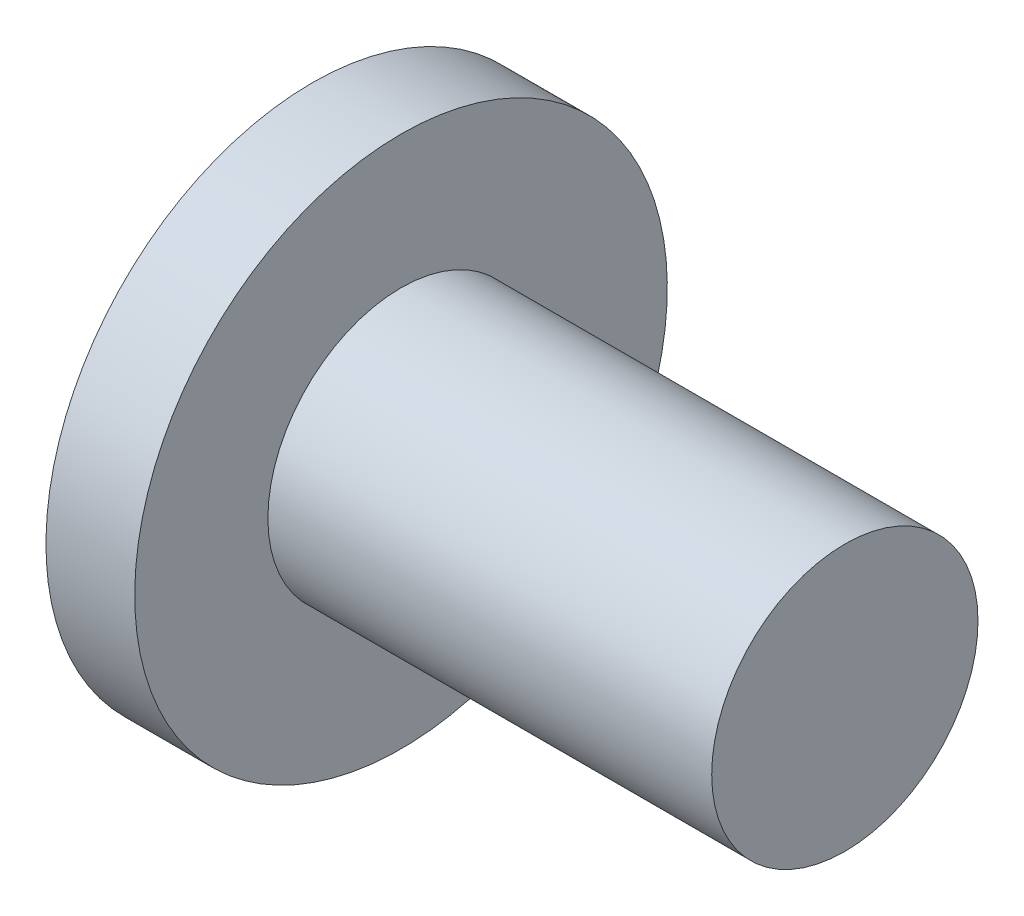
ISO-10303-21;
HEADER;
FILE_DESCRIPTION(('STEP AP214'),'2;1');
FILE_NAME('part.step','',(''),(''),'','','');
FILE_SCHEMA(('AUTOMOTIVE_DESIGN { 1 0 10303 214 1 1 1 1 }'));
ENDSEC;
DATA;
#1=APPLICATION_CONTEXT('core data for automotive mechanical design processes');
#2=APPLICATION_PROTOCOL_DEFINITION('international standard','automotive_design',2000,#1);
#3=PRODUCT_CONTEXT('',#1,'mechanical');
#4=PRODUCT('Part','Part','',(#3));
#5=PRODUCT_RELATED_PRODUCT_CATEGORY('part','',(#4));
#6=PRODUCT_DEFINITION_FORMATION('','',#4);
#7=PRODUCT_DEFINITION_CONTEXT('part definition',#1,'design');
#8=PRODUCT_DEFINITION('design','',#6,#7);
#9=PRODUCT_DEFINITION_SHAPE('','',#8);
#10=(LENGTH_UNIT() NAMED_UNIT(*) SI_UNIT(.MILLI.,.METRE.));
#11=(NAMED_UNIT(*) PLANE_ANGLE_UNIT() SI_UNIT($,.RADIAN.));
#12=(NAMED_UNIT(*) SI_UNIT($,.STERADIAN.) SOLID_ANGLE_UNIT());
#13=UNCERTAINTY_MEASURE_WITH_UNIT(LENGTH_MEASURE(1.E-05),#10,'distance_accuracy_value','');
#14=(GEOMETRIC_REPRESENTATION_CONTEXT(3) GLOBAL_UNCERTAINTY_ASSIGNED_CONTEXT((#13)) GLOBAL_UNIT_ASSIGNED_CONTEXT((#10,
#11,#12)) REPRESENTATION_CONTEXT('',''));
#15=CARTESIAN_POINT('',(0.,0.,0.));
#16=DIRECTION('',(0.,0.,1.));
#17=DIRECTION('',(1.,0.,0.));
#18=AXIS2_PLACEMENT_3D('',#15,#16,#17);
#19=CARTESIAN_POINT('',(0.,3.,0.));
#20=DIRECTION('',(1.,0.,0.));
#21=DIRECTION('',(0.,1.,0.));
#22=AXIS2_PLACEMENT_3D('',#19,#20,#21);
#23=PLANE('',#22);
#24=CARTESIAN_POINT('',(0.,0.,0.));
#25=DIRECTION('',(1.,0.,0.));
#26=DIRECTION('',(0.,1.,0.));
#27=AXIS2_PLACEMENT_3D('',#24,#25,#26);
#28=CIRCLE('',#27,3.);
#29=CARTESIAN_POINT('',(0.,3.,0.));
#30=VERTEX_POINT('',#29);
#31=EDGE_CURVE('E47',#30,#30,#28,.T.);
#32=ORIENTED_EDGE('',*,*,#31,.T.);
#33=EDGE_LOOP('',(#32));
#34=FACE_BOUND('',#33,.T.);
#35=ADVANCED_FACE('F33',(#34),#23,.T.);
#36=CARTESIAN_POINT('',(-12.,0.,0.));
#37=DIRECTION('',(-1.,0.,0.));
#38=DIRECTION('',(0.,-1.,0.));
#39=AXIS2_PLACEMENT_3D('',#36,#37,#38);
#40=PLANE('',#39);
#41=CARTESIAN_POINT('',(-12.,0.,0.));
#42=DIRECTION('',(1.,0.,0.));
#43=DIRECTION('',(0.,1.,0.));
#44=AXIS2_PLACEMENT_3D('',#41,#42,#43);
#45=CIRCLE('',#44,6.);
#46=CARTESIAN_POINT('',(-12.,6.,0.));
#47=VERTEX_POINT('',#46);
#48=EDGE_CURVE('E10',#47,#47,#45,.T.);
#49=ORIENTED_EDGE('',*,*,#48,.F.);
#50=EDGE_LOOP('',(#49));
#51=FACE_BOUND('',#50,.T.);
#52=ADVANCED_FACE('F65',(#51),#40,.T.);
#53=CARTESIAN_POINT('',(0.,0.,0.));
#54=DIRECTION('',(1.,0.,0.));
#55=DIRECTION('',(0.,1.,0.));
#56=AXIS2_PLACEMENT_3D('',#53,#54,#55);
#57=CYLINDRICAL_SURFACE('',#56,6.);
#58=ORIENTED_EDGE('',*,*,#48,.T.);
#59=EDGE_LOOP('',(#58));
#60=FACE_BOUND('',#59,.T.);
#61=CARTESIAN_POINT('',(-10.,0.,0.));
#62=DIRECTION('',(1.,0.,0.));
#63=DIRECTION('',(0.,1.,0.));
#64=AXIS2_PLACEMENT_3D('',#61,#62,#63);
#65=CIRCLE('',#64,6.);
#66=CARTESIAN_POINT('',(-10.,6.,0.));
#67=VERTEX_POINT('',#66);
#68=EDGE_CURVE('E39',#67,#67,#65,.T.);
#69=ORIENTED_EDGE('',*,*,#68,.F.);
#70=EDGE_LOOP('',(#69));
#71=FACE_BOUND('',#70,.T.);
#72=ADVANCED_FACE('F62',(#60,#71),#57,.T.);
#73=CARTESIAN_POINT('',(-10.,6.,0.));
#74=DIRECTION('',(1.,0.,0.));
#75=DIRECTION('',(0.,1.,0.));
#76=AXIS2_PLACEMENT_3D('',#73,#74,#75);
#77=PLANE('',#76);
#78=ORIENTED_EDGE('',*,*,#68,.T.);
#79=EDGE_LOOP('',(#78));
#80=FACE_BOUND('',#79,.T.);
#81=CARTESIAN_POINT('',(-10.,0.,0.));
#82=DIRECTION('',(1.,0.,0.));
#83=DIRECTION('',(0.,1.,0.));
#84=AXIS2_PLACEMENT_3D('',#81,#82,#83);
#85=CIRCLE('',#84,3.);
#86=CARTESIAN_POINT('',(-10.,3.,0.));
#87=VERTEX_POINT('',#86);
#88=EDGE_CURVE('E43',#87,#87,#85,.T.);
#89=ORIENTED_EDGE('',*,*,#88,.F.);
#90=EDGE_LOOP('',(#89));
#91=FACE_BOUND('',#90,.T.);
#92=ADVANCED_FACE('F56',(#80,#91),#77,.T.);
#93=CARTESIAN_POINT('',(0.,0.,0.));
#94=DIRECTION('',(1.,0.,0.));
#95=DIRECTION('',(0.,1.,0.));
#96=AXIS2_PLACEMENT_3D('',#93,#94,#95);
#97=CYLINDRICAL_SURFACE('',#96,3.);
#98=ORIENTED_EDGE('',*,*,#88,.T.);
#99=EDGE_LOOP('',(#98));
#100=FACE_BOUND('',#99,.T.);
#101=ORIENTED_EDGE('',*,*,#31,.F.);
#102=EDGE_LOOP('',(#101));
#103=FACE_BOUND('',#102,.T.);
#104=ADVANCED_FACE('F54',(#100,#103),#97,.T.);
#105=CLOSED_SHELL('',(#35,#52,#72,#92,#104));
#106=MANIFOLD_SOLID_BREP('B2',#105);
#107=ADVANCED_BREP_SHAPE_REPRESENTATION('',(#18,#106),#14);
#108=SHAPE_DEFINITION_REPRESENTATION(#9,#107);
ENDSEC;
END-ISO-10303-21;
